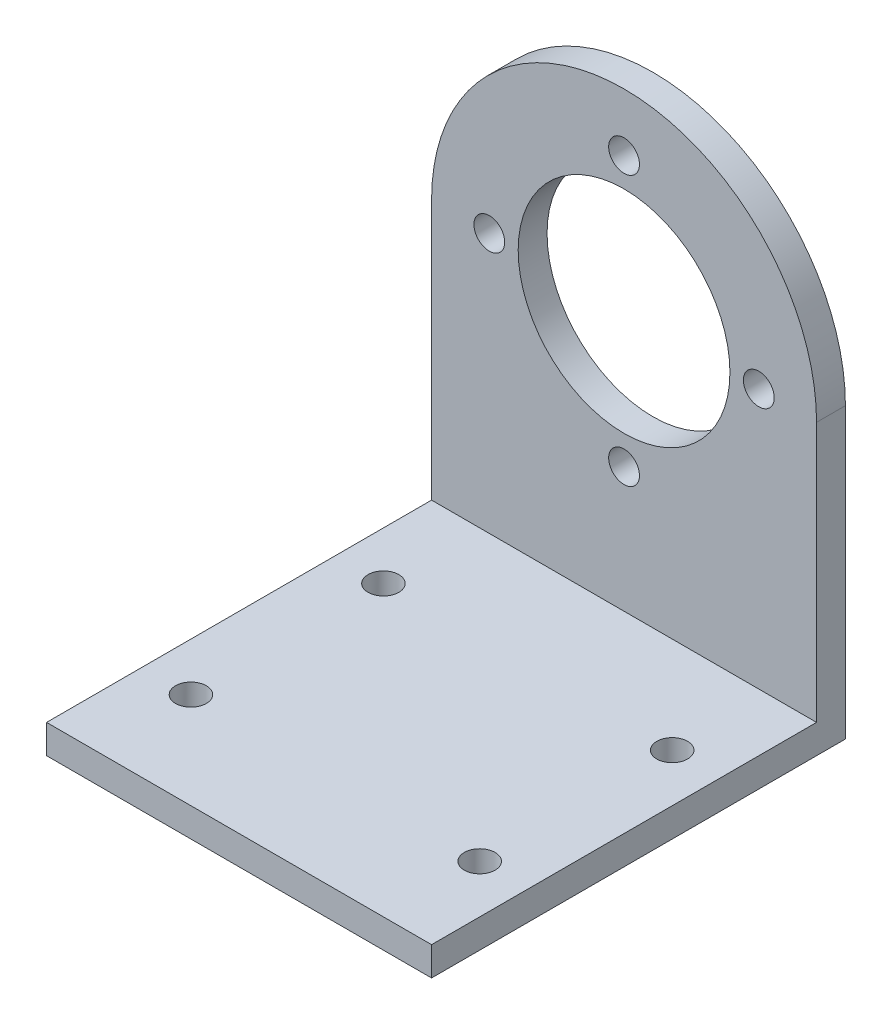
ISO-10303-21;
HEADER;
FILE_DESCRIPTION(('STEP AP214'),'2;1');
FILE_NAME('part.step','',(''),(''),'','','');
FILE_SCHEMA(('AUTOMOTIVE_DESIGN { 1 0 10303 214 1 1 1 1 }'));
ENDSEC;
DATA;
#1=APPLICATION_CONTEXT('core data for automotive mechanical design processes');
#2=APPLICATION_PROTOCOL_DEFINITION('international standard','automotive_design',2000,#1);
#3=PRODUCT_CONTEXT('',#1,'mechanical');
#4=PRODUCT('Part','Part','',(#3));
#5=PRODUCT_RELATED_PRODUCT_CATEGORY('part','',(#4));
#6=PRODUCT_DEFINITION_FORMATION('','',#4);
#7=PRODUCT_DEFINITION_CONTEXT('part definition',#1,'design');
#8=PRODUCT_DEFINITION('design','',#6,#7);
#9=PRODUCT_DEFINITION_SHAPE('','',#8);
#10=(LENGTH_UNIT() NAMED_UNIT(*) SI_UNIT(.MILLI.,.METRE.));
#11=(NAMED_UNIT(*) PLANE_ANGLE_UNIT() SI_UNIT($,.RADIAN.));
#12=(NAMED_UNIT(*) SI_UNIT($,.STERADIAN.) SOLID_ANGLE_UNIT());
#13=UNCERTAINTY_MEASURE_WITH_UNIT(LENGTH_MEASURE(1.E-05),#10,'distance_accuracy_value','');
#14=(GEOMETRIC_REPRESENTATION_CONTEXT(3) GLOBAL_UNCERTAINTY_ASSIGNED_CONTEXT((#13)) GLOBAL_UNIT_ASSIGNED_CONTEXT((#10,
#11,#12)) REPRESENTATION_CONTEXT('',''));
#15=CARTESIAN_POINT('',(0.,0.,0.));
#16=DIRECTION('',(0.,0.,1.));
#17=DIRECTION('',(1.,0.,0.));
#18=AXIS2_PLACEMENT_3D('',#15,#16,#17);
#19=CARTESIAN_POINT('',(-20.,-13.5,3.));
#20=DIRECTION('',(1.,0.,0.));
#21=DIRECTION('',(0.,0.,-1.));
#22=AXIS2_PLACEMENT_3D('',#19,#20,#21);
#23=PLANE('',#22);
#24=DIRECTION('',(0.,-1.,0.));
#25=VECTOR('',#24,1.);
#26=CARTESIAN_POINT('',(-20.,-13.5,0.));
#27=LINE('',#26,#25);
#28=CARTESIAN_POINT('',(-20.,13.5,0.));
#29=VERTEX_POINT('',#28);
#30=CARTESIAN_POINT('',(-20.,-16.5,0.));
#31=VERTEX_POINT('',#30);
#32=EDGE_CURVE('E119',#29,#31,#27,.T.);
#33=ORIENTED_EDGE('',*,*,#32,.T.);
#34=DIRECTION('',(0.,0.,-1.));
#35=VECTOR('',#34,1.);
#36=CARTESIAN_POINT('',(-20.,-16.5,0.));
#37=LINE('',#36,#35);
#38=CARTESIAN_POINT('',(-20.,-16.5,43.));
#39=VERTEX_POINT('',#38);
#40=EDGE_CURVE('E94',#39,#31,#37,.T.);
#41=ORIENTED_EDGE('',*,*,#40,.F.);
#42=DIRECTION('',(0.,1.,0.));
#43=VECTOR('',#42,1.);
#44=CARTESIAN_POINT('',(-20.,-16.5,43.));
#45=LINE('',#44,#43);
#46=CARTESIAN_POINT('',(-20.,-13.5,43.));
#47=VERTEX_POINT('',#46);
#48=EDGE_CURVE('E90',#39,#47,#45,.T.);
#49=ORIENTED_EDGE('',*,*,#48,.T.);
#50=DIRECTION('',(0.,0.,-1.));
#51=VECTOR('',#50,1.);
#52=CARTESIAN_POINT('',(-20.,-13.5,0.));
#53=LINE('',#52,#51);
#54=CARTESIAN_POINT('',(-20.,-13.5,3.));
#55=VERTEX_POINT('',#54);
#56=EDGE_CURVE('E104',#47,#55,#53,.T.);
#57=ORIENTED_EDGE('',*,*,#56,.T.);
#58=DIRECTION('',(0.,-1.,0.));
#59=VECTOR('',#58,1.);
#60=CARTESIAN_POINT('',(-20.,-13.5,3.));
#61=LINE('',#60,#59);
#62=CARTESIAN_POINT('',(-20.,13.5,3.));
#63=VERTEX_POINT('',#62);
#64=EDGE_CURVE('E50',#63,#55,#61,.T.);
#65=ORIENTED_EDGE('',*,*,#64,.F.);
#66=DIRECTION('',(0.,0.,-1.));
#67=VECTOR('',#66,1.);
#68=CARTESIAN_POINT('',(-20.,13.5,3.));
#69=LINE('',#68,#67);
#70=EDGE_CURVE('E42',#63,#29,#69,.T.);
#71=ORIENTED_EDGE('',*,*,#70,.T.);
#72=EDGE_LOOP('',(#33,#41,#49,#57,#65,#71));
#73=FACE_BOUND('',#72,.T.);
#74=ADVANCED_FACE('F33',(#73),#23,.F.);
#75=CARTESIAN_POINT('',(20.,-13.5,3.));
#76=DIRECTION('',(-1.,0.,0.));
#77=DIRECTION('',(0.,0.,1.));
#78=AXIS2_PLACEMENT_3D('',#75,#76,#77);
#79=PLANE('',#78);
#80=DIRECTION('',(0.,1.,0.));
#81=VECTOR('',#80,1.);
#82=CARTESIAN_POINT('',(20.,-13.5,0.));
#83=LINE('',#82,#81);
#84=CARTESIAN_POINT('',(20.,-16.5,0.));
#85=VERTEX_POINT('',#84);
#86=CARTESIAN_POINT('',(20.,13.5,0.));
#87=VERTEX_POINT('',#86);
#88=EDGE_CURVE('E123',#85,#87,#83,.T.);
#89=ORIENTED_EDGE('',*,*,#88,.T.);
#90=DIRECTION('',(0.,0.,-1.));
#91=VECTOR('',#90,1.);
#92=CARTESIAN_POINT('',(20.,13.5,3.));
#93=LINE('',#92,#91);
#94=CARTESIAN_POINT('',(20.,13.5,3.));
#95=VERTEX_POINT('',#94);
#96=EDGE_CURVE('E11',#95,#87,#93,.T.);
#97=ORIENTED_EDGE('',*,*,#96,.F.);
#98=DIRECTION('',(0.,1.,0.));
#99=VECTOR('',#98,1.);
#100=CARTESIAN_POINT('',(20.,-13.5,3.));
#101=LINE('',#100,#99);
#102=CARTESIAN_POINT('',(20.,-13.5,3.));
#103=VERTEX_POINT('',#102);
#104=EDGE_CURVE('E126',#103,#95,#101,.T.);
#105=ORIENTED_EDGE('',*,*,#104,.F.);
#106=DIRECTION('',(0.,0.,1.));
#107=VECTOR('',#106,1.);
#108=CARTESIAN_POINT('',(20.,-13.5,0.));
#109=LINE('',#108,#107);
#110=CARTESIAN_POINT('',(20.,-13.5,43.));
#111=VERTEX_POINT('',#110);
#112=EDGE_CURVE('E108',#103,#111,#109,.T.);
#113=ORIENTED_EDGE('',*,*,#112,.T.);
#114=DIRECTION('',(0.,1.,0.));
#115=VECTOR('',#114,1.);
#116=CARTESIAN_POINT('',(20.,-16.5,43.));
#117=LINE('',#116,#115);
#118=CARTESIAN_POINT('',(20.,-16.5,43.));
#119=VERTEX_POINT('',#118);
#120=EDGE_CURVE('E88',#119,#111,#117,.T.);
#121=ORIENTED_EDGE('',*,*,#120,.F.);
#122=DIRECTION('',(0.,0.,1.));
#123=VECTOR('',#122,1.);
#124=CARTESIAN_POINT('',(20.,-16.5,0.));
#125=LINE('',#124,#123);
#126=EDGE_CURVE('E95',#85,#119,#125,.T.);
#127=ORIENTED_EDGE('',*,*,#126,.F.);
#128=EDGE_LOOP('',(#89,#97,#105,#113,#121,#127));
#129=FACE_BOUND('',#128,.T.);
#130=ADVANCED_FACE('F106',(#129),#79,.F.);
#131=CARTESIAN_POINT('',(0.,0.,3.));
#132=DIRECTION('',(0.,0.,-1.));
#133=DIRECTION('',(-1.,0.,0.));
#134=AXIS2_PLACEMENT_3D('',#131,#132,#133);
#135=PLANE('',#134);
#136=CARTESIAN_POINT('',(14.,13.5,3.));
#137=DIRECTION('',(0.,0.,-1.));
#138=DIRECTION('',(-1.,0.,0.));
#139=AXIS2_PLACEMENT_3D('',#136,#137,#138);
#140=CIRCLE('',#139,1.6);
#141=CARTESIAN_POINT('',(12.4,13.5,3.));
#142=VERTEX_POINT('',#141);
#143=EDGE_CURVE('E171',#142,#142,#140,.T.);
#144=ORIENTED_EDGE('',*,*,#143,.T.);
#145=EDGE_LOOP('',(#144));
#146=FACE_BOUND('',#145,.T.);
#147=CARTESIAN_POINT('',(0.,-0.499999999999997,3.));
#148=DIRECTION('',(0.,0.,-1.));
#149=DIRECTION('',(-1.,0.,0.));
#150=AXIS2_PLACEMENT_3D('',#147,#148,#149);
#151=CIRCLE('',#150,1.6);
#152=CARTESIAN_POINT('',(-1.6,-0.499999999999997,3.));
#153=VERTEX_POINT('',#152);
#154=EDGE_CURVE('E168',#153,#153,#151,.T.);
#155=ORIENTED_EDGE('',*,*,#154,.T.);
#156=EDGE_LOOP('',(#155));
#157=FACE_BOUND('',#156,.T.);
#158=CARTESIAN_POINT('',(-14.,13.5000000000001,3.));
#159=DIRECTION('',(0.,0.,-1.));
#160=DIRECTION('',(-1.,0.,0.));
#161=AXIS2_PLACEMENT_3D('',#158,#159,#160);
#162=CIRCLE('',#161,1.6);
#163=CARTESIAN_POINT('',(-15.6,13.5000000000001,3.));
#164=VERTEX_POINT('',#163);
#165=EDGE_CURVE('E160',#164,#164,#162,.T.);
#166=ORIENTED_EDGE('',*,*,#165,.T.);
#167=EDGE_LOOP('',(#166));
#168=FACE_BOUND('',#167,.T.);
#169=CARTESIAN_POINT('',(0.,27.5,3.));
#170=DIRECTION('',(0.,0.,-1.));
#171=DIRECTION('',(-1.,0.,0.));
#172=AXIS2_PLACEMENT_3D('',#169,#170,#171);
#173=CIRCLE('',#172,1.6);
#174=CARTESIAN_POINT('',(-1.6,27.5,3.));
#175=VERTEX_POINT('',#174);
#176=EDGE_CURVE('E177',#175,#175,#173,.T.);
#177=ORIENTED_EDGE('',*,*,#176,.T.);
#178=EDGE_LOOP('',(#177));
#179=FACE_BOUND('',#178,.T.);
#180=CARTESIAN_POINT('',(0.,13.5,3.));
#181=DIRECTION('',(0.,0.,-1.));
#182=DIRECTION('',(-1.,0.,0.));
#183=AXIS2_PLACEMENT_3D('',#180,#181,#182);
#184=CIRCLE('',#183,11.);
#185=CARTESIAN_POINT('',(-11.,13.5,3.));
#186=VERTEX_POINT('',#185);
#187=EDGE_CURVE('E183',#186,#186,#184,.T.);
#188=ORIENTED_EDGE('',*,*,#187,.T.);
#189=EDGE_LOOP('',(#188));
#190=FACE_BOUND('',#189,.T.);
#191=ORIENTED_EDGE('',*,*,#64,.T.);
#192=DIRECTION('',(1.,0.,0.));
#193=VECTOR('',#192,1.);
#194=CARTESIAN_POINT('',(20.,-13.5,3.));
#195=LINE('',#194,#193);
#196=EDGE_CURVE('E122',#55,#103,#195,.T.);
#197=ORIENTED_EDGE('',*,*,#196,.T.);
#198=ORIENTED_EDGE('',*,*,#104,.T.);
#199=CARTESIAN_POINT('',(0.,13.5,3.));
#200=DIRECTION('',(0.,0.,-1.));
#201=DIRECTION('',(1.,0.,0.));
#202=AXIS2_PLACEMENT_3D('',#199,#200,#201);
#203=CIRCLE('',#202,20.);
#204=EDGE_CURVE('E113',#63,#95,#203,.T.);
#205=ORIENTED_EDGE('',*,*,#204,.F.);
#206=EDGE_LOOP('',(#191,#197,#198,#205));
#207=FACE_BOUND('',#206,.T.);
#208=ADVANCED_FACE('F194',(#146,#157,#168,#179,#190,#207),#135,.F.);
#209=CARTESIAN_POINT('',(0.,0.,0.));
#210=DIRECTION('',(0.,0.,-1.));
#211=DIRECTION('',(-1.,0.,0.));
#212=AXIS2_PLACEMENT_3D('',#209,#210,#211);
#213=PLANE('',#212);
#214=CARTESIAN_POINT('',(14.,13.5,0.));
#215=DIRECTION('',(0.,0.,-1.));
#216=DIRECTION('',(0.,1.,0.));
#217=AXIS2_PLACEMENT_3D('',#214,#215,#216);
#218=CIRCLE('',#217,1.6);
#219=CARTESIAN_POINT('',(14.,15.1,0.));
#220=VERTEX_POINT('',#219);
#221=EDGE_CURVE('E157',#220,#220,#218,.T.);
#222=ORIENTED_EDGE('',*,*,#221,.F.);
#223=EDGE_LOOP('',(#222));
#224=FACE_BOUND('',#223,.T.);
#225=CARTESIAN_POINT('',(0.,-0.499999999999997,0.));
#226=DIRECTION('',(0.,0.,-1.));
#227=DIRECTION('',(1.,0.,0.));
#228=AXIS2_PLACEMENT_3D('',#225,#226,#227);
#229=CIRCLE('',#228,1.6);
#230=CARTESIAN_POINT('',(1.6,-0.499999999999997,0.));
#231=VERTEX_POINT('',#230);
#232=EDGE_CURVE('E161',#231,#231,#229,.T.);
#233=ORIENTED_EDGE('',*,*,#232,.F.);
#234=EDGE_LOOP('',(#233));
#235=FACE_BOUND('',#234,.T.);
#236=CARTESIAN_POINT('',(-14.,13.5000000000001,0.));
#237=DIRECTION('',(0.,0.,-1.));
#238=DIRECTION('',(0.,-1.,0.));
#239=AXIS2_PLACEMENT_3D('',#236,#237,#238);
#240=CIRCLE('',#239,1.6);
#241=CARTESIAN_POINT('',(-14.,11.9000000000001,0.));
#242=VERTEX_POINT('',#241);
#243=EDGE_CURVE('E134',#242,#242,#240,.T.);
#244=ORIENTED_EDGE('',*,*,#243,.F.);
#245=EDGE_LOOP('',(#244));
#246=FACE_BOUND('',#245,.T.);
#247=CARTESIAN_POINT('',(0.,27.5,0.));
#248=DIRECTION('',(0.,0.,-1.));
#249=DIRECTION('',(-1.,0.,0.));
#250=AXIS2_PLACEMENT_3D('',#247,#248,#249);
#251=CIRCLE('',#250,1.6);
#252=CARTESIAN_POINT('',(-1.6,27.5,0.));
#253=VERTEX_POINT('',#252);
#254=EDGE_CURVE('E174',#253,#253,#251,.T.);
#255=ORIENTED_EDGE('',*,*,#254,.F.);
#256=EDGE_LOOP('',(#255));
#257=FACE_BOUND('',#256,.T.);
#258=CARTESIAN_POINT('',(0.,13.5,0.));
#259=DIRECTION('',(0.,0.,-1.));
#260=DIRECTION('',(-1.,0.,0.));
#261=AXIS2_PLACEMENT_3D('',#258,#259,#260);
#262=CIRCLE('',#261,11.);
#263=CARTESIAN_POINT('',(-11.,13.5,0.));
#264=VERTEX_POINT('',#263);
#265=EDGE_CURVE('E180',#264,#264,#262,.T.);
#266=ORIENTED_EDGE('',*,*,#265,.F.);
#267=EDGE_LOOP('',(#266));
#268=FACE_BOUND('',#267,.T.);
#269=ORIENTED_EDGE('',*,*,#32,.F.);
#270=CARTESIAN_POINT('',(0.,13.5,0.));
#271=DIRECTION('',(0.,0.,-1.));
#272=DIRECTION('',(1.,0.,0.));
#273=AXIS2_PLACEMENT_3D('',#270,#271,#272);
#274=CIRCLE('',#273,20.);
#275=EDGE_CURVE('E110',#29,#87,#274,.T.);
#276=ORIENTED_EDGE('',*,*,#275,.T.);
#277=ORIENTED_EDGE('',*,*,#88,.F.);
#278=DIRECTION('',(1.,0.,0.));
#279=VECTOR('',#278,1.);
#280=CARTESIAN_POINT('',(20.,-16.5,0.));
#281=LINE('',#280,#279);
#282=EDGE_CURVE('E101',#31,#85,#281,.T.);
#283=ORIENTED_EDGE('',*,*,#282,.F.);
#284=EDGE_LOOP('',(#269,#276,#277,#283));
#285=FACE_BOUND('',#284,.T.);
#286=ADVANCED_FACE('F200',(#224,#235,#246,#257,#268,#285),#213,.T.);
#287=CARTESIAN_POINT('',(0.,13.5,3.));
#288=DIRECTION('',(0.,0.,-1.));
#289=DIRECTION('',(-1.,0.,0.));
#290=AXIS2_PLACEMENT_3D('',#287,#288,#289);
#291=CYLINDRICAL_SURFACE('',#290,20.);
#292=ORIENTED_EDGE('',*,*,#275,.F.);
#293=ORIENTED_EDGE('',*,*,#70,.F.);
#294=ORIENTED_EDGE('',*,*,#204,.T.);
#295=ORIENTED_EDGE('',*,*,#96,.T.);
#296=EDGE_LOOP('',(#292,#293,#294,#295));
#297=FACE_BOUND('',#296,.T.);
#298=ADVANCED_FACE('F198',(#297),#291,.T.);
#299=CARTESIAN_POINT('',(20.,-16.5,43.));
#300=DIRECTION('',(0.,0.,-1.));
#301=DIRECTION('',(-1.,0.,0.));
#302=AXIS2_PLACEMENT_3D('',#299,#300,#301);
#303=PLANE('',#302);
#304=DIRECTION('',(-1.,0.,0.));
#305=VECTOR('',#304,1.);
#306=CARTESIAN_POINT('',(20.,-13.5,43.));
#307=LINE('',#306,#305);
#308=EDGE_CURVE('E189',#111,#47,#307,.T.);
#309=ORIENTED_EDGE('',*,*,#308,.T.);
#310=ORIENTED_EDGE('',*,*,#48,.F.);
#311=DIRECTION('',(-1.,0.,0.));
#312=VECTOR('',#311,1.);
#313=CARTESIAN_POINT('',(20.,-16.5,43.));
#314=LINE('',#313,#312);
#315=EDGE_CURVE('E84',#119,#39,#314,.T.);
#316=ORIENTED_EDGE('',*,*,#315,.F.);
#317=ORIENTED_EDGE('',*,*,#120,.T.);
#318=EDGE_LOOP('',(#309,#310,#316,#317));
#319=FACE_BOUND('',#318,.T.);
#320=ADVANCED_FACE('F86',(#319),#303,.F.);
#321=CARTESIAN_POINT('',(0.,-16.5,0.));
#322=DIRECTION('',(0.,-1.,0.));
#323=DIRECTION('',(1.,0.,0.));
#324=AXIS2_PLACEMENT_3D('',#321,#322,#323);
#325=PLANE('',#324);
#326=CARTESIAN_POINT('',(-15.,-16.5,33.));
#327=DIRECTION('',(0.,1.,0.));
#328=DIRECTION('',(-1.,0.,0.));
#329=AXIS2_PLACEMENT_3D('',#326,#327,#328);
#330=CIRCLE('',#329,1.6);
#331=CARTESIAN_POINT('',(-16.6,-16.5,33.));
#332=VERTEX_POINT('',#331);
#333=EDGE_CURVE('E141',#332,#332,#330,.T.);
#334=ORIENTED_EDGE('',*,*,#333,.T.);
#335=EDGE_LOOP('',(#334));
#336=FACE_BOUND('',#335,.T.);
#337=CARTESIAN_POINT('',(-15.,-16.5,13.));
#338=DIRECTION('',(0.,1.,0.));
#339=DIRECTION('',(-1.,0.,0.));
#340=AXIS2_PLACEMENT_3D('',#337,#338,#339);
#341=CIRCLE('',#340,1.6);
#342=CARTESIAN_POINT('',(-16.6,-16.5,13.));
#343=VERTEX_POINT('',#342);
#344=EDGE_CURVE('E146',#343,#343,#341,.T.);
#345=ORIENTED_EDGE('',*,*,#344,.T.);
#346=EDGE_LOOP('',(#345));
#347=FACE_BOUND('',#346,.T.);
#348=CARTESIAN_POINT('',(15.,-16.5,13.));
#349=DIRECTION('',(0.,-1.,0.));
#350=DIRECTION('',(1.,0.,0.));
#351=AXIS2_PLACEMENT_3D('',#348,#349,#350);
#352=CIRCLE('',#351,1.6);
#353=CARTESIAN_POINT('',(16.6,-16.5,13.));
#354=VERTEX_POINT('',#353);
#355=EDGE_CURVE('E138',#354,#354,#352,.T.);
#356=ORIENTED_EDGE('',*,*,#355,.F.);
#357=EDGE_LOOP('',(#356));
#358=FACE_BOUND('',#357,.T.);
#359=CARTESIAN_POINT('',(15.,-16.5,33.));
#360=DIRECTION('',(0.,-1.,0.));
#361=DIRECTION('',(1.,0.,0.));
#362=AXIS2_PLACEMENT_3D('',#359,#360,#361);
#363=CIRCLE('',#362,1.6);
#364=CARTESIAN_POINT('',(16.6,-16.5,33.));
#365=VERTEX_POINT('',#364);
#366=EDGE_CURVE('E135',#365,#365,#363,.T.);
#367=ORIENTED_EDGE('',*,*,#366,.F.);
#368=EDGE_LOOP('',(#367));
#369=FACE_BOUND('',#368,.T.);
#370=ORIENTED_EDGE('',*,*,#126,.T.);
#371=ORIENTED_EDGE('',*,*,#315,.T.);
#372=ORIENTED_EDGE('',*,*,#40,.T.);
#373=ORIENTED_EDGE('',*,*,#282,.T.);
#374=EDGE_LOOP('',(#370,#371,#372,#373));
#375=FACE_BOUND('',#374,.T.);
#376=ADVANCED_FACE('F99',(#336,#347,#358,#369,#375),#325,.T.);
#377=CARTESIAN_POINT('',(0.,-13.5,0.));
#378=DIRECTION('',(0.,-1.,0.));
#379=DIRECTION('',(1.,0.,0.));
#380=AXIS2_PLACEMENT_3D('',#377,#378,#379);
#381=PLANE('',#380);
#382=CARTESIAN_POINT('',(-15.,-13.5,33.));
#383=DIRECTION('',(0.,-1.,0.));
#384=DIRECTION('',(1.,0.,0.));
#385=AXIS2_PLACEMENT_3D('',#382,#383,#384);
#386=CIRCLE('',#385,1.6);
#387=CARTESIAN_POINT('',(-13.4,-13.5,33.));
#388=VERTEX_POINT('',#387);
#389=EDGE_CURVE('E36',#388,#388,#386,.F.);
#390=ORIENTED_EDGE('',*,*,#389,.F.);
#391=EDGE_LOOP('',(#390));
#392=FACE_BOUND('',#391,.T.);
#393=CARTESIAN_POINT('',(-15.,-13.5,13.));
#394=DIRECTION('',(0.,-1.,0.));
#395=DIRECTION('',(1.,0.,0.));
#396=AXIS2_PLACEMENT_3D('',#393,#394,#395);
#397=CIRCLE('',#396,1.6);
#398=CARTESIAN_POINT('',(-13.4,-13.5,13.));
#399=VERTEX_POINT('',#398);
#400=EDGE_CURVE('E139',#399,#399,#397,.F.);
#401=ORIENTED_EDGE('',*,*,#400,.F.);
#402=EDGE_LOOP('',(#401));
#403=FACE_BOUND('',#402,.T.);
#404=CARTESIAN_POINT('',(15.,-13.5,13.));
#405=DIRECTION('',(0.,-1.,0.));
#406=DIRECTION('',(1.,0.,0.));
#407=AXIS2_PLACEMENT_3D('',#404,#405,#406);
#408=CIRCLE('',#407,1.6);
#409=CARTESIAN_POINT('',(16.6,-13.5,13.));
#410=VERTEX_POINT('',#409);
#411=EDGE_CURVE('E136',#410,#410,#408,.T.);
#412=ORIENTED_EDGE('',*,*,#411,.T.);
#413=EDGE_LOOP('',(#412));
#414=FACE_BOUND('',#413,.T.);
#415=CARTESIAN_POINT('',(15.,-13.5,33.));
#416=DIRECTION('',(0.,-1.,0.));
#417=DIRECTION('',(1.,0.,0.));
#418=AXIS2_PLACEMENT_3D('',#415,#416,#417);
#419=CIRCLE('',#418,1.6);
#420=CARTESIAN_POINT('',(16.6,-13.5,33.));
#421=VERTEX_POINT('',#420);
#422=EDGE_CURVE('E131',#421,#421,#419,.T.);
#423=ORIENTED_EDGE('',*,*,#422,.T.);
#424=EDGE_LOOP('',(#423));
#425=FACE_BOUND('',#424,.T.);
#426=ORIENTED_EDGE('',*,*,#196,.F.);
#427=ORIENTED_EDGE('',*,*,#56,.F.);
#428=ORIENTED_EDGE('',*,*,#308,.F.);
#429=ORIENTED_EDGE('',*,*,#112,.F.);
#430=EDGE_LOOP('',(#426,#427,#428,#429));
#431=FACE_BOUND('',#430,.T.);
#432=ADVANCED_FACE('F300',(#392,#403,#414,#425,#431),#381,.F.);
#433=CARTESIAN_POINT('',(0.,13.5,43.));
#434=DIRECTION('',(0.,0.,-1.));
#435=DIRECTION('',(-1.,0.,0.));
#436=AXIS2_PLACEMENT_3D('',#433,#434,#435);
#437=CYLINDRICAL_SURFACE('',#436,11.);
#438=ORIENTED_EDGE('',*,*,#265,.T.);
#439=EDGE_LOOP('',(#438));
#440=FACE_BOUND('',#439,.T.);
#441=ORIENTED_EDGE('',*,*,#187,.F.);
#442=EDGE_LOOP('',(#441));
#443=FACE_BOUND('',#442,.T.);
#444=ADVANCED_FACE('F310',(#440,#443),#437,.F.);
#445=CARTESIAN_POINT('',(0.,27.5,43.));
#446=DIRECTION('',(0.,0.,-1.));
#447=DIRECTION('',(-1.,0.,0.));
#448=AXIS2_PLACEMENT_3D('',#445,#446,#447);
#449=CYLINDRICAL_SURFACE('',#448,1.6);
#450=ORIENTED_EDGE('',*,*,#254,.T.);
#451=EDGE_LOOP('',(#450));
#452=FACE_BOUND('',#451,.T.);
#453=ORIENTED_EDGE('',*,*,#176,.F.);
#454=EDGE_LOOP('',(#453));
#455=FACE_BOUND('',#454,.T.);
#456=ADVANCED_FACE('F232',(#452,#455),#449,.F.);
#457=CARTESIAN_POINT('',(-14.,13.5000000000001,43.));
#458=DIRECTION('',(0.,0.,-1.));
#459=DIRECTION('',(-1.,0.,0.));
#460=AXIS2_PLACEMENT_3D('',#457,#458,#459);
#461=CYLINDRICAL_SURFACE('',#460,1.6);
#462=ORIENTED_EDGE('',*,*,#243,.T.);
#463=EDGE_LOOP('',(#462));
#464=FACE_BOUND('',#463,.T.);
#465=ORIENTED_EDGE('',*,*,#165,.F.);
#466=EDGE_LOOP('',(#465));
#467=FACE_BOUND('',#466,.T.);
#468=ADVANCED_FACE('F243',(#464,#467),#461,.F.);
#469=CARTESIAN_POINT('',(0.,-0.499999999999997,43.));
#470=DIRECTION('',(0.,0.,-1.));
#471=DIRECTION('',(-1.,0.,0.));
#472=AXIS2_PLACEMENT_3D('',#469,#470,#471);
#473=CYLINDRICAL_SURFACE('',#472,1.6);
#474=ORIENTED_EDGE('',*,*,#232,.T.);
#475=EDGE_LOOP('',(#474));
#476=FACE_BOUND('',#475,.T.);
#477=ORIENTED_EDGE('',*,*,#154,.F.);
#478=EDGE_LOOP('',(#477));
#479=FACE_BOUND('',#478,.T.);
#480=ADVANCED_FACE('F248',(#476,#479),#473,.F.);
#481=CARTESIAN_POINT('',(14.,13.5,43.));
#482=DIRECTION('',(0.,0.,-1.));
#483=DIRECTION('',(-1.,0.,0.));
#484=AXIS2_PLACEMENT_3D('',#481,#482,#483);
#485=CYLINDRICAL_SURFACE('',#484,1.6);
#486=ORIENTED_EDGE('',*,*,#221,.T.);
#487=EDGE_LOOP('',(#486));
#488=FACE_BOUND('',#487,.T.);
#489=ORIENTED_EDGE('',*,*,#143,.F.);
#490=EDGE_LOOP('',(#489));
#491=FACE_BOUND('',#490,.T.);
#492=ADVANCED_FACE('F258',(#488,#491),#485,.F.);
#493=CARTESIAN_POINT('',(15.,33.5,33.));
#494=DIRECTION('',(0.,-1.,0.));
#495=DIRECTION('',(1.,0.,0.));
#496=AXIS2_PLACEMENT_3D('',#493,#494,#495);
#497=CYLINDRICAL_SURFACE('',#496,1.6);
#498=ORIENTED_EDGE('',*,*,#366,.T.);
#499=EDGE_LOOP('',(#498));
#500=FACE_BOUND('',#499,.T.);
#501=ORIENTED_EDGE('',*,*,#422,.F.);
#502=EDGE_LOOP('',(#501));
#503=FACE_BOUND('',#502,.T.);
#504=ADVANCED_FACE('F268',(#500,#503),#497,.F.);
#505=CARTESIAN_POINT('',(15.,33.5,13.));
#506=DIRECTION('',(0.,-1.,0.));
#507=DIRECTION('',(1.,0.,0.));
#508=AXIS2_PLACEMENT_3D('',#505,#506,#507);
#509=CYLINDRICAL_SURFACE('',#508,1.6);
#510=ORIENTED_EDGE('',*,*,#355,.T.);
#511=EDGE_LOOP('',(#510));
#512=FACE_BOUND('',#511,.T.);
#513=ORIENTED_EDGE('',*,*,#411,.F.);
#514=EDGE_LOOP('',(#513));
#515=FACE_BOUND('',#514,.T.);
#516=ADVANCED_FACE('F278',(#512,#515),#509,.F.);
#517=CARTESIAN_POINT('',(-15.,33.5,13.));
#518=DIRECTION('',(0.,-1.,0.));
#519=DIRECTION('',(1.,0.,0.));
#520=AXIS2_PLACEMENT_3D('',#517,#518,#519);
#521=CYLINDRICAL_SURFACE('',#520,1.6);
#522=ORIENTED_EDGE('',*,*,#344,.F.);
#523=EDGE_LOOP('',(#522));
#524=FACE_BOUND('',#523,.T.);
#525=ORIENTED_EDGE('',*,*,#400,.T.);
#526=EDGE_LOOP('',(#525));
#527=FACE_BOUND('',#526,.T.);
#528=ADVANCED_FACE('F288',(#524,#527),#521,.F.);
#529=CARTESIAN_POINT('',(-15.,33.5,33.));
#530=DIRECTION('',(0.,-1.,0.));
#531=DIRECTION('',(1.,0.,0.));
#532=AXIS2_PLACEMENT_3D('',#529,#530,#531);
#533=CYLINDRICAL_SURFACE('',#532,1.6);
#534=ORIENTED_EDGE('',*,*,#333,.F.);
#535=EDGE_LOOP('',(#534));
#536=FACE_BOUND('',#535,.T.);
#537=ORIENTED_EDGE('',*,*,#389,.T.);
#538=EDGE_LOOP('',(#537));
#539=FACE_BOUND('',#538,.T.);
#540=ADVANCED_FACE('F320',(#536,#539),#533,.F.);
#541=CLOSED_SHELL('',(#74,#130,#208,#286,#298,#320,#376,#432,#444,#456,#468,#480,#492,#504,#516,
#528,#540));
#542=MANIFOLD_SOLID_BREP('B2',#541);
#543=ADVANCED_BREP_SHAPE_REPRESENTATION('',(#18,#542),#14);
#544=SHAPE_DEFINITION_REPRESENTATION(#9,#543);
ENDSEC;
END-ISO-10303-21;
